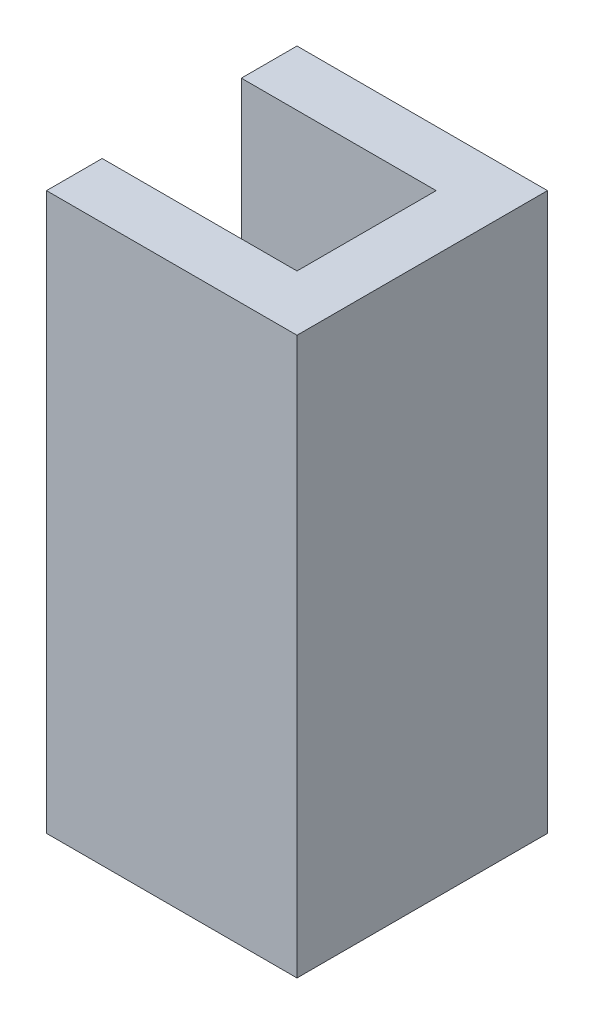
ISO-10303-21;
HEADER;
FILE_DESCRIPTION(('STEP AP214'),'2;1');
FILE_NAME('part.step','',(''),(''),'','','');
FILE_SCHEMA(('AUTOMOTIVE_DESIGN { 1 0 10303 214 1 1 1 1 }'));
ENDSEC;
DATA;
#1=APPLICATION_CONTEXT('core data for automotive mechanical design processes');
#2=APPLICATION_PROTOCOL_DEFINITION('international standard','automotive_design',2000,#1);
#3=PRODUCT_CONTEXT('',#1,'mechanical');
#4=PRODUCT('Part','Part','',(#3));
#5=PRODUCT_RELATED_PRODUCT_CATEGORY('part','',(#4));
#6=PRODUCT_DEFINITION_FORMATION('','',#4);
#7=PRODUCT_DEFINITION_CONTEXT('part definition',#1,'design');
#8=PRODUCT_DEFINITION('design','',#6,#7);
#9=PRODUCT_DEFINITION_SHAPE('','',#8);
#10=(LENGTH_UNIT() NAMED_UNIT(*) SI_UNIT(.MILLI.,.METRE.));
#11=(NAMED_UNIT(*) PLANE_ANGLE_UNIT() SI_UNIT($,.RADIAN.));
#12=(NAMED_UNIT(*) SI_UNIT($,.STERADIAN.) SOLID_ANGLE_UNIT());
#13=UNCERTAINTY_MEASURE_WITH_UNIT(LENGTH_MEASURE(1.E-05),#10,'distance_accuracy_value','');
#14=(GEOMETRIC_REPRESENTATION_CONTEXT(3) GLOBAL_UNCERTAINTY_ASSIGNED_CONTEXT((#13)) GLOBAL_UNIT_ASSIGNED_CONTEXT((#10,
#11,#12)) REPRESENTATION_CONTEXT('',''));
#15=CARTESIAN_POINT('',(0.,0.,0.));
#16=DIRECTION('',(0.,0.,1.));
#17=DIRECTION('',(1.,0.,0.));
#18=AXIS2_PLACEMENT_3D('',#15,#16,#17);
#19=CARTESIAN_POINT('',(-4.5,20.,4.5));
#20=DIRECTION('',(1.,0.,0.));
#21=DIRECTION('',(0.,0.,-1.));
#22=AXIS2_PLACEMENT_3D('',#19,#20,#21);
#23=PLANE('',#22);
#24=DIRECTION('',(0.,0.,1.));
#25=VECTOR('',#24,1.);
#26=CARTESIAN_POINT('',(-4.5,20.,4.5));
#27=LINE('',#26,#25);
#28=CARTESIAN_POINT('',(-4.5,20.,2.5));
#29=VERTEX_POINT('',#28);
#30=CARTESIAN_POINT('',(-4.5,20.,4.5));
#31=VERTEX_POINT('',#30);
#32=EDGE_CURVE('E162',#29,#31,#27,.T.);
#33=ORIENTED_EDGE('',*,*,#32,.F.);
#34=DIRECTION('',(0.,1.,0.));
#35=VECTOR('',#34,1.);
#36=CARTESIAN_POINT('',(-4.5,0.,2.5));
#37=LINE('',#36,#35);
#38=CARTESIAN_POINT('',(-4.5,0.,2.5));
#39=VERTEX_POINT('',#38);
#40=EDGE_CURVE('E136',#39,#29,#37,.T.);
#41=ORIENTED_EDGE('',*,*,#40,.F.);
#42=DIRECTION('',(0.,0.,1.));
#43=VECTOR('',#42,1.);
#44=CARTESIAN_POINT('',(-4.5,0.,4.5));
#45=LINE('',#44,#43);
#46=CARTESIAN_POINT('',(-4.5,0.,4.5));
#47=VERTEX_POINT('',#46);
#48=EDGE_CURVE('E141',#39,#47,#45,.T.);
#49=ORIENTED_EDGE('',*,*,#48,.T.);
#50=DIRECTION('',(0.,-1.,0.));
#51=VECTOR('',#50,1.);
#52=CARTESIAN_POINT('',(-4.5,20.,4.5));
#53=LINE('',#52,#51);
#54=EDGE_CURVE('E154',#31,#47,#53,.T.);
#55=ORIENTED_EDGE('',*,*,#54,.F.);
#56=EDGE_LOOP('',(#33,#41,#49,#55));
#57=FACE_BOUND('',#56,.T.);
#58=ADVANCED_FACE('F39',(#57),#23,.F.);
#59=CARTESIAN_POINT('',(0.,20.,0.));
#60=DIRECTION('',(0.,-1.,0.));
#61=DIRECTION('',(0.,0.,-1.));
#62=AXIS2_PLACEMENT_3D('',#59,#60,#61);
#63=PLANE('',#62);
#64=DIRECTION('',(1.,0.,0.));
#65=VECTOR('',#64,1.);
#66=CARTESIAN_POINT('',(-2.5,20.,2.5));
#67=LINE('',#66,#65);
#68=CARTESIAN_POINT('',(2.5,20.,2.5));
#69=VERTEX_POINT('',#68);
#70=EDGE_CURVE('E182',#29,#69,#67,.T.);
#71=ORIENTED_EDGE('',*,*,#70,.F.);
#72=ORIENTED_EDGE('',*,*,#32,.T.);
#73=DIRECTION('',(1.,0.,0.));
#74=VECTOR('',#73,1.);
#75=CARTESIAN_POINT('',(-4.5,20.,4.5));
#76=LINE('',#75,#74);
#77=CARTESIAN_POINT('',(4.5,20.,4.5));
#78=VERTEX_POINT('',#77);
#79=EDGE_CURVE('E64',#31,#78,#76,.T.);
#80=ORIENTED_EDGE('',*,*,#79,.T.);
#81=DIRECTION('',(0.,0.,-1.));
#82=VECTOR('',#81,1.);
#83=CARTESIAN_POINT('',(4.5,20.,4.5));
#84=LINE('',#83,#82);
#85=CARTESIAN_POINT('',(4.5,20.,-4.5));
#86=VERTEX_POINT('',#85);
#87=EDGE_CURVE('E145',#78,#86,#84,.T.);
#88=ORIENTED_EDGE('',*,*,#87,.T.);
#89=DIRECTION('',(-1.,0.,0.));
#90=VECTOR('',#89,1.);
#91=CARTESIAN_POINT('',(-4.5,20.,-4.5));
#92=LINE('',#91,#90);
#93=CARTESIAN_POINT('',(-4.5,20.,-4.5));
#94=VERTEX_POINT('',#93);
#95=EDGE_CURVE('E92',#86,#94,#92,.T.);
#96=ORIENTED_EDGE('',*,*,#95,.T.);
#97=CARTESIAN_POINT('',(-4.5,20.,-2.5));
#98=VERTEX_POINT('',#97);
#99=EDGE_CURVE('E159',#94,#98,#27,.T.);
#100=ORIENTED_EDGE('',*,*,#99,.T.);
#101=DIRECTION('',(-1.,0.,0.));
#102=VECTOR('',#101,1.);
#103=CARTESIAN_POINT('',(-2.5,20.,-2.5));
#104=LINE('',#103,#102);
#105=CARTESIAN_POINT('',(2.5,20.,-2.5));
#106=VERTEX_POINT('',#105);
#107=EDGE_CURVE('E131',#106,#98,#104,.T.);
#108=ORIENTED_EDGE('',*,*,#107,.F.);
#109=DIRECTION('',(0.,0.,-1.));
#110=VECTOR('',#109,1.);
#111=CARTESIAN_POINT('',(2.5,20.,2.5));
#112=LINE('',#111,#110);
#113=EDGE_CURVE('E188',#69,#106,#112,.T.);
#114=ORIENTED_EDGE('',*,*,#113,.F.);
#115=EDGE_LOOP('',(#71,#72,#80,#88,#96,#100,#108,#114));
#116=FACE_BOUND('',#115,.T.);
#117=ADVANCED_FACE('F203',(#116),#63,.F.);
#118=CARTESIAN_POINT('',(0.,0.,0.));
#119=DIRECTION('',(0.,-1.,0.));
#120=DIRECTION('',(0.,0.,-1.));
#121=AXIS2_PLACEMENT_3D('',#118,#119,#120);
#122=PLANE('',#121);
#123=ORIENTED_EDGE('',*,*,#48,.F.);
#124=DIRECTION('',(1.,0.,0.));
#125=VECTOR('',#124,1.);
#126=CARTESIAN_POINT('',(-2.5,0.,2.5));
#127=LINE('',#126,#125);
#128=CARTESIAN_POINT('',(2.5,0.,2.5));
#129=VERTEX_POINT('',#128);
#130=EDGE_CURVE('E125',#39,#129,#127,.T.);
#131=ORIENTED_EDGE('',*,*,#130,.T.);
#132=DIRECTION('',(0.,0.,-1.));
#133=VECTOR('',#132,1.);
#134=CARTESIAN_POINT('',(2.5,0.,2.5));
#135=LINE('',#134,#133);
#136=CARTESIAN_POINT('',(2.5,0.,-2.5));
#137=VERTEX_POINT('',#136);
#138=EDGE_CURVE('E55',#129,#137,#135,.T.);
#139=ORIENTED_EDGE('',*,*,#138,.T.);
#140=DIRECTION('',(-1.,0.,0.));
#141=VECTOR('',#140,1.);
#142=CARTESIAN_POINT('',(-2.5,0.,-2.5));
#143=LINE('',#142,#141);
#144=CARTESIAN_POINT('',(-4.5,0.,-2.5));
#145=VERTEX_POINT('',#144);
#146=EDGE_CURVE('E115',#137,#145,#143,.T.);
#147=ORIENTED_EDGE('',*,*,#146,.T.);
#148=CARTESIAN_POINT('',(-4.5,0.,-4.5));
#149=VERTEX_POINT('',#148);
#150=EDGE_CURVE('E120',#149,#145,#45,.T.);
#151=ORIENTED_EDGE('',*,*,#150,.F.);
#152=DIRECTION('',(-1.,0.,0.));
#153=VECTOR('',#152,1.);
#154=CARTESIAN_POINT('',(-4.5,0.,-4.5));
#155=LINE('',#154,#153);
#156=CARTESIAN_POINT('',(4.5,0.,-4.5));
#157=VERTEX_POINT('',#156);
#158=EDGE_CURVE('E147',#157,#149,#155,.T.);
#159=ORIENTED_EDGE('',*,*,#158,.F.);
#160=DIRECTION('',(0.,0.,-1.));
#161=VECTOR('',#160,1.);
#162=CARTESIAN_POINT('',(4.5,0.,4.5));
#163=LINE('',#162,#161);
#164=CARTESIAN_POINT('',(4.5,0.,4.5));
#165=VERTEX_POINT('',#164);
#166=EDGE_CURVE('E173',#165,#157,#163,.T.);
#167=ORIENTED_EDGE('',*,*,#166,.F.);
#168=DIRECTION('',(1.,0.,0.));
#169=VECTOR('',#168,1.);
#170=CARTESIAN_POINT('',(-4.5,0.,4.5));
#171=LINE('',#170,#169);
#172=EDGE_CURVE('E85',#47,#165,#171,.T.);
#173=ORIENTED_EDGE('',*,*,#172,.F.);
#174=EDGE_LOOP('',(#123,#131,#139,#147,#151,#159,#167,#173));
#175=FACE_BOUND('',#174,.T.);
#176=ADVANCED_FACE('F118',(#175),#122,.T.);
#177=CARTESIAN_POINT('',(4.5,20.,4.5));
#178=DIRECTION('',(-1.,0.,0.));
#179=DIRECTION('',(0.,0.,1.));
#180=AXIS2_PLACEMENT_3D('',#177,#178,#179);
#181=PLANE('',#180);
#182=ORIENTED_EDGE('',*,*,#166,.T.);
#183=DIRECTION('',(0.,-1.,0.));
#184=VECTOR('',#183,1.);
#185=CARTESIAN_POINT('',(4.5,20.,-4.5));
#186=LINE('',#185,#184);
#187=EDGE_CURVE('E11',#86,#157,#186,.T.);
#188=ORIENTED_EDGE('',*,*,#187,.F.);
#189=ORIENTED_EDGE('',*,*,#87,.F.);
#190=DIRECTION('',(0.,-1.,0.));
#191=VECTOR('',#190,1.);
#192=CARTESIAN_POINT('',(4.5,20.,4.5));
#193=LINE('',#192,#191);
#194=EDGE_CURVE('E151',#78,#165,#193,.T.);
#195=ORIENTED_EDGE('',*,*,#194,.T.);
#196=EDGE_LOOP('',(#182,#188,#189,#195));
#197=FACE_BOUND('',#196,.T.);
#198=ADVANCED_FACE('F41',(#197),#181,.F.);
#199=CARTESIAN_POINT('',(-4.5,20.,-4.5));
#200=DIRECTION('',(0.,0.,1.));
#201=DIRECTION('',(1.,0.,0.));
#202=AXIS2_PLACEMENT_3D('',#199,#200,#201);
#203=PLANE('',#202);
#204=ORIENTED_EDGE('',*,*,#158,.T.);
#205=DIRECTION('',(0.,-1.,0.));
#206=VECTOR('',#205,1.);
#207=CARTESIAN_POINT('',(-4.5,20.,-4.5));
#208=LINE('',#207,#206);
#209=EDGE_CURVE('E48',#94,#149,#208,.T.);
#210=ORIENTED_EDGE('',*,*,#209,.F.);
#211=ORIENTED_EDGE('',*,*,#95,.F.);
#212=ORIENTED_EDGE('',*,*,#187,.T.);
#213=EDGE_LOOP('',(#204,#210,#211,#212));
#214=FACE_BOUND('',#213,.T.);
#215=ADVANCED_FACE('F222',(#214),#203,.F.);
#216=ORIENTED_EDGE('',*,*,#150,.T.);
#217=DIRECTION('',(0.,1.,0.));
#218=VECTOR('',#217,1.);
#219=CARTESIAN_POINT('',(-4.5,0.,-2.5));
#220=LINE('',#219,#218);
#221=EDGE_CURVE('E128',#145,#98,#220,.T.);
#222=ORIENTED_EDGE('',*,*,#221,.T.);
#223=ORIENTED_EDGE('',*,*,#99,.F.);
#224=ORIENTED_EDGE('',*,*,#209,.T.);
#225=EDGE_LOOP('',(#216,#222,#223,#224));
#226=FACE_BOUND('',#225,.T.);
#227=ADVANCED_FACE('F139',(#226),#23,.F.);
#228=CARTESIAN_POINT('',(-4.5,20.,4.5));
#229=DIRECTION('',(0.,0.,-1.));
#230=DIRECTION('',(-1.,0.,0.));
#231=AXIS2_PLACEMENT_3D('',#228,#229,#230);
#232=PLANE('',#231);
#233=ORIENTED_EDGE('',*,*,#172,.T.);
#234=ORIENTED_EDGE('',*,*,#194,.F.);
#235=ORIENTED_EDGE('',*,*,#79,.F.);
#236=ORIENTED_EDGE('',*,*,#54,.T.);
#237=EDGE_LOOP('',(#233,#234,#235,#236));
#238=FACE_BOUND('',#237,.T.);
#239=ADVANCED_FACE('F207',(#238),#232,.F.);
#240=CARTESIAN_POINT('',(2.5,20.,2.5));
#241=DIRECTION('',(-1.,0.,0.));
#242=DIRECTION('',(0.,0.,1.));
#243=AXIS2_PLACEMENT_3D('',#240,#241,#242);
#244=PLANE('',#243);
#245=ORIENTED_EDGE('',*,*,#138,.F.);
#246=DIRECTION('',(0.,-1.,0.));
#247=VECTOR('',#246,1.);
#248=CARTESIAN_POINT('',(2.5,20.,2.5));
#249=LINE('',#248,#247);
#250=EDGE_CURVE('E180',#69,#129,#249,.T.);
#251=ORIENTED_EDGE('',*,*,#250,.F.);
#252=ORIENTED_EDGE('',*,*,#113,.T.);
#253=DIRECTION('',(0.,-1.,0.));
#254=VECTOR('',#253,1.);
#255=CARTESIAN_POINT('',(2.5,20.,-2.5));
#256=LINE('',#255,#254);
#257=EDGE_CURVE('E171',#106,#137,#256,.T.);
#258=ORIENTED_EDGE('',*,*,#257,.T.);
#259=EDGE_LOOP('',(#245,#251,#252,#258));
#260=FACE_BOUND('',#259,.T.);
#261=ADVANCED_FACE('F205',(#260),#244,.T.);
#262=CARTESIAN_POINT('',(-2.5,20.,-2.5));
#263=DIRECTION('',(0.,0.,1.));
#264=DIRECTION('',(1.,0.,0.));
#265=AXIS2_PLACEMENT_3D('',#262,#263,#264);
#266=PLANE('',#265);
#267=ORIENTED_EDGE('',*,*,#146,.F.);
#268=ORIENTED_EDGE('',*,*,#257,.F.);
#269=ORIENTED_EDGE('',*,*,#107,.T.);
#270=ORIENTED_EDGE('',*,*,#221,.F.);
#271=EDGE_LOOP('',(#267,#268,#269,#270));
#272=FACE_BOUND('',#271,.T.);
#273=ADVANCED_FACE('F129',(#272),#266,.T.);
#274=CARTESIAN_POINT('',(-2.5,20.,2.5));
#275=DIRECTION('',(0.,0.,-1.));
#276=DIRECTION('',(-1.,0.,0.));
#277=AXIS2_PLACEMENT_3D('',#274,#275,#276);
#278=PLANE('',#277);
#279=ORIENTED_EDGE('',*,*,#130,.F.);
#280=ORIENTED_EDGE('',*,*,#40,.T.);
#281=ORIENTED_EDGE('',*,*,#70,.T.);
#282=ORIENTED_EDGE('',*,*,#250,.T.);
#283=EDGE_LOOP('',(#279,#280,#281,#282));
#284=FACE_BOUND('',#283,.T.);
#285=ADVANCED_FACE('F200',(#284),#278,.T.);
#286=CLOSED_SHELL('',(#58,#117,#176,#198,#215,#227,#239,#261,#273,#285));
#287=MANIFOLD_SOLID_BREP('B2',#286);
#288=ADVANCED_BREP_SHAPE_REPRESENTATION('',(#18,#287),#14);
#289=SHAPE_DEFINITION_REPRESENTATION(#9,#288);
ENDSEC;
END-ISO-10303-21;
